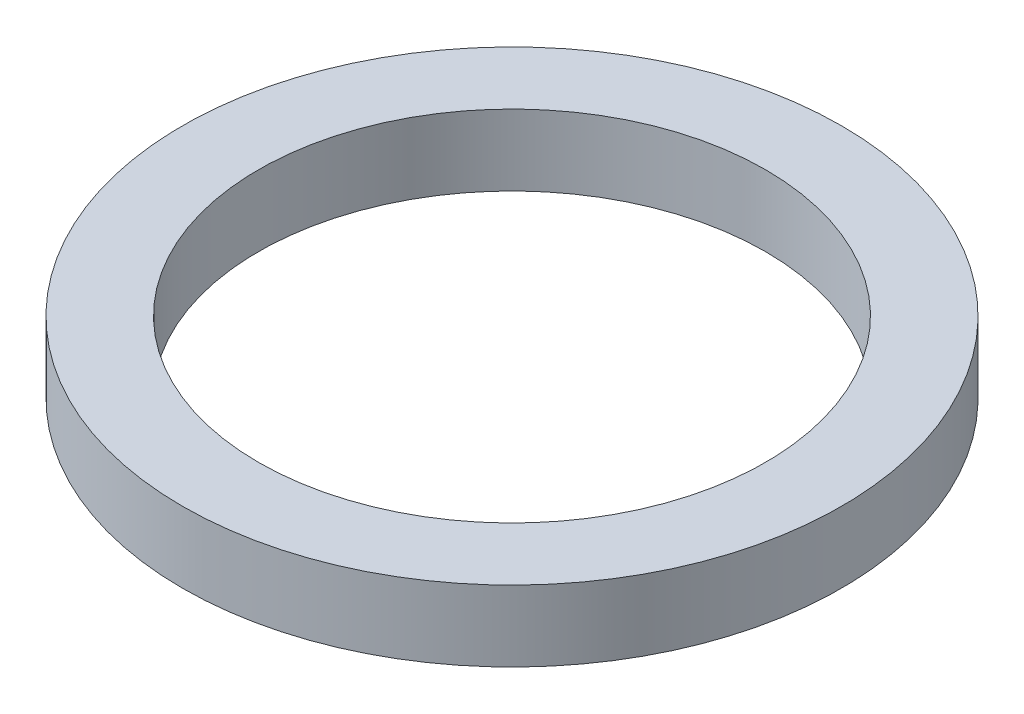
ISO-10303-21;
HEADER;
FILE_DESCRIPTION(('STEP AP214'),'2;1');
FILE_NAME('part.step','',(''),(''),'','','');
FILE_SCHEMA(('AUTOMOTIVE_DESIGN { 1 0 10303 214 1 1 1 1 }'));
ENDSEC;
DATA;
#1=APPLICATION_CONTEXT('core data for automotive mechanical design processes');
#2=APPLICATION_PROTOCOL_DEFINITION('international standard','automotive_design',2000,#1);
#3=PRODUCT_CONTEXT('',#1,'mechanical');
#4=PRODUCT('Part','Part','',(#3));
#5=PRODUCT_RELATED_PRODUCT_CATEGORY('part','',(#4));
#6=PRODUCT_DEFINITION_FORMATION('','',#4);
#7=PRODUCT_DEFINITION_CONTEXT('part definition',#1,'design');
#8=PRODUCT_DEFINITION('design','',#6,#7);
#9=PRODUCT_DEFINITION_SHAPE('','',#8);
#10=(LENGTH_UNIT() NAMED_UNIT(*) SI_UNIT(.MILLI.,.METRE.));
#11=(NAMED_UNIT(*) PLANE_ANGLE_UNIT() SI_UNIT($,.RADIAN.));
#12=(NAMED_UNIT(*) SI_UNIT($,.STERADIAN.) SOLID_ANGLE_UNIT());
#13=UNCERTAINTY_MEASURE_WITH_UNIT(LENGTH_MEASURE(1.E-05),#10,'distance_accuracy_value','');
#14=(GEOMETRIC_REPRESENTATION_CONTEXT(3) GLOBAL_UNCERTAINTY_ASSIGNED_CONTEXT((#13)) GLOBAL_UNIT_ASSIGNED_CONTEXT((#10,
#11,#12)) REPRESENTATION_CONTEXT('',''));
#15=CARTESIAN_POINT('',(0.,0.,0.));
#16=DIRECTION('',(0.,0.,1.));
#17=DIRECTION('',(1.,0.,0.));
#18=AXIS2_PLACEMENT_3D('',#15,#16,#17);
#19=CARTESIAN_POINT('',(0.,7.,0.));
#20=DIRECTION('',(0.,1.,0.));
#21=DIRECTION('',(0.,0.,1.));
#22=AXIS2_PLACEMENT_3D('',#19,#20,#21);
#23=PLANE('',#22);
#24=CARTESIAN_POINT('',(0.,7.,0.));
#25=DIRECTION('',(0.,1.,0.));
#26=DIRECTION('',(0.,0.,1.));
#27=AXIS2_PLACEMENT_3D('',#24,#25,#26);
#28=CIRCLE('',#27,32.5);
#29=CARTESIAN_POINT('',(0.,7.,32.5));
#30=VERTEX_POINT('',#29);
#31=EDGE_CURVE('E10',#30,#30,#28,.T.);
#32=ORIENTED_EDGE('',*,*,#31,.T.);
#33=EDGE_LOOP('',(#32));
#34=FACE_BOUND('',#33,.T.);
#35=CARTESIAN_POINT('',(0.,7.,0.));
#36=DIRECTION('',(0.,1.,0.));
#37=DIRECTION('',(0.,0.,1.));
#38=AXIS2_PLACEMENT_3D('',#35,#36,#37);
#39=CIRCLE('',#38,25.);
#40=CARTESIAN_POINT('',(0.,7.,25.));
#41=VERTEX_POINT('',#40);
#42=EDGE_CURVE('E49',#41,#41,#39,.T.);
#43=ORIENTED_EDGE('',*,*,#42,.F.);
#44=EDGE_LOOP('',(#43));
#45=FACE_BOUND('',#44,.T.);
#46=ADVANCED_FACE('F38',(#34,#45),#23,.T.);
#47=CARTESIAN_POINT('',(0.,0.,0.));
#48=DIRECTION('',(0.,1.,0.));
#49=DIRECTION('',(0.,0.,1.));
#50=AXIS2_PLACEMENT_3D('',#47,#48,#49);
#51=PLANE('',#50);
#52=CARTESIAN_POINT('',(0.,0.,0.));
#53=DIRECTION('',(0.,1.,0.));
#54=DIRECTION('',(0.,0.,1.));
#55=AXIS2_PLACEMENT_3D('',#52,#53,#54);
#56=CIRCLE('',#55,32.5);
#57=CARTESIAN_POINT('',(0.,0.,32.5));
#58=VERTEX_POINT('',#57);
#59=EDGE_CURVE('E42',#58,#58,#56,.T.);
#60=ORIENTED_EDGE('',*,*,#59,.F.);
#61=EDGE_LOOP('',(#60));
#62=FACE_BOUND('',#61,.T.);
#63=CARTESIAN_POINT('',(0.,0.,0.));
#64=DIRECTION('',(0.,1.,0.));
#65=DIRECTION('',(0.,0.,1.));
#66=AXIS2_PLACEMENT_3D('',#63,#64,#65);
#67=CIRCLE('',#66,25.);
#68=CARTESIAN_POINT('',(0.,0.,25.));
#69=VERTEX_POINT('',#68);
#70=EDGE_CURVE('E51',#69,#69,#67,.T.);
#71=ORIENTED_EDGE('',*,*,#70,.T.);
#72=EDGE_LOOP('',(#71));
#73=FACE_BOUND('',#72,.T.);
#74=ADVANCED_FACE('F61',(#62,#73),#51,.F.);
#75=CARTESIAN_POINT('',(0.,7.,0.));
#76=DIRECTION('',(0.,-1.,0.));
#77=DIRECTION('',(0.,0.,-1.));
#78=AXIS2_PLACEMENT_3D('',#75,#76,#77);
#79=CYLINDRICAL_SURFACE('',#78,32.5);
#80=ORIENTED_EDGE('',*,*,#31,.F.);
#81=EDGE_LOOP('',(#80));
#82=FACE_BOUND('',#81,.T.);
#83=ORIENTED_EDGE('',*,*,#59,.T.);
#84=EDGE_LOOP('',(#83));
#85=FACE_BOUND('',#84,.T.);
#86=ADVANCED_FACE('F40',(#82,#85),#79,.T.);
#87=CARTESIAN_POINT('',(0.,7.,0.));
#88=DIRECTION('',(0.,-1.,0.));
#89=DIRECTION('',(0.,0.,-1.));
#90=AXIS2_PLACEMENT_3D('',#87,#88,#89);
#91=CYLINDRICAL_SURFACE('',#90,25.);
#92=ORIENTED_EDGE('',*,*,#42,.T.);
#93=EDGE_LOOP('',(#92));
#94=FACE_BOUND('',#93,.T.);
#95=ORIENTED_EDGE('',*,*,#70,.F.);
#96=EDGE_LOOP('',(#95));
#97=FACE_BOUND('',#96,.T.);
#98=ADVANCED_FACE('F57',(#94,#97),#91,.F.);
#99=CLOSED_SHELL('',(#46,#74,#86,#98));
#100=MANIFOLD_SOLID_BREP('B2',#99);
#101=ADVANCED_BREP_SHAPE_REPRESENTATION('',(#18,#100),#14);
#102=SHAPE_DEFINITION_REPRESENTATION(#9,#101);
ENDSEC;
END-ISO-10303-21;
